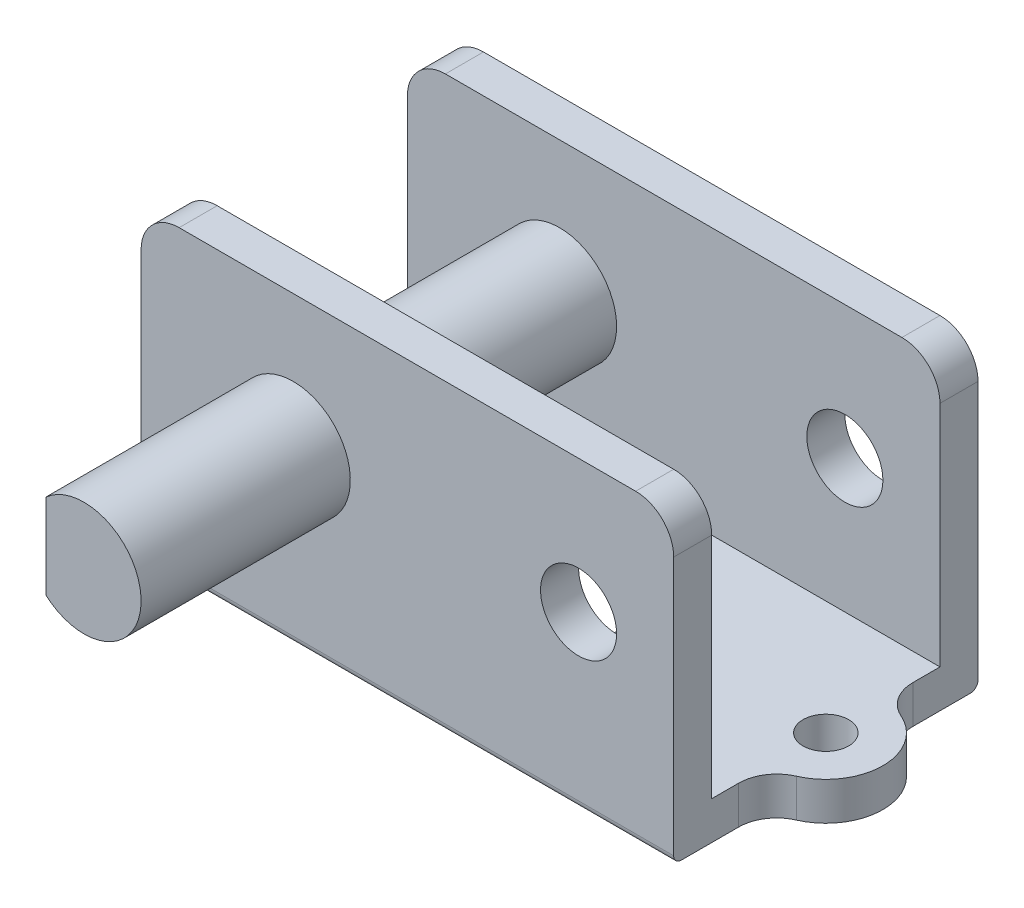
ISO-10303-21;
HEADER;
FILE_DESCRIPTION(('STEP AP214'),'2;1');
FILE_NAME('part.step','',(''),(''),'','','');
FILE_SCHEMA(('AUTOMOTIVE_DESIGN { 1 0 10303 214 1 1 1 1 }'));
ENDSEC;
DATA;
#1=APPLICATION_CONTEXT('core data for automotive mechanical design processes');
#2=APPLICATION_PROTOCOL_DEFINITION('international standard','automotive_design',2000,#1);
#3=PRODUCT_CONTEXT('',#1,'mechanical');
#4=PRODUCT('Part','Part','',(#3));
#5=PRODUCT_RELATED_PRODUCT_CATEGORY('part','',(#4));
#6=PRODUCT_DEFINITION_FORMATION('','',#4);
#7=PRODUCT_DEFINITION_CONTEXT('part definition',#1,'design');
#8=PRODUCT_DEFINITION('design','',#6,#7);
#9=PRODUCT_DEFINITION_SHAPE('','',#8);
#10=(LENGTH_UNIT() NAMED_UNIT(*) SI_UNIT(.MILLI.,.METRE.));
#11=(NAMED_UNIT(*) PLANE_ANGLE_UNIT() SI_UNIT($,.RADIAN.));
#12=(NAMED_UNIT(*) SI_UNIT($,.STERADIAN.) SOLID_ANGLE_UNIT());
#13=UNCERTAINTY_MEASURE_WITH_UNIT(LENGTH_MEASURE(1.E-05),#10,'distance_accuracy_value','');
#14=(GEOMETRIC_REPRESENTATION_CONTEXT(3) GLOBAL_UNCERTAINTY_ASSIGNED_CONTEXT((#13)) GLOBAL_UNIT_ASSIGNED_CONTEXT((#10,
#11,#12)) REPRESENTATION_CONTEXT('',''));
#15=CARTESIAN_POINT('',(0.,0.,0.));
#16=DIRECTION('',(0.,0.,1.));
#17=DIRECTION('',(1.,0.,0.));
#18=AXIS2_PLACEMENT_3D('',#15,#16,#17);
#19=CARTESIAN_POINT('',(-7.,0.,4.));
#20=DIRECTION('',(1.,0.,0.));
#21=DIRECTION('',(0.,0.,-1.));
#22=AXIS2_PLACEMENT_3D('',#19,#20,#21);
#23=PLANE('',#22);
#24=DIRECTION('',(0.,0.,1.));
#25=VECTOR('',#24,1.);
#26=CARTESIAN_POINT('',(-7.,1.,0.));
#27=LINE('',#26,#25);
#28=CARTESIAN_POINT('',(-7.,1.,2.29128784747792));
#29=VERTEX_POINT('',#28);
#30=CARTESIAN_POINT('',(-7.,1.,3.));
#31=VERTEX_POINT('',#30);
#32=EDGE_CURVE('E253',#29,#31,#27,.T.);
#33=ORIENTED_EDGE('',*,*,#32,.F.);
#34=DIRECTION('',(0.,-1.,0.));
#35=VECTOR('',#34,1.);
#36=CARTESIAN_POINT('',(-7.,0.,2.29128784747792));
#37=LINE('',#36,#35);
#38=CARTESIAN_POINT('',(-7.,0.,2.29128784747792));
#39=VERTEX_POINT('',#38);
#40=EDGE_CURVE('E386',#29,#39,#37,.T.);
#41=ORIENTED_EDGE('',*,*,#40,.T.);
#42=DIRECTION('',(0.,0.,-1.));
#43=VECTOR('',#42,1.);
#44=CARTESIAN_POINT('',(-7.,0.,4.));
#45=LINE('',#44,#43);
#46=CARTESIAN_POINT('',(-7.,0.,3.8));
#47=VERTEX_POINT('',#46);
#48=EDGE_CURVE('E296',#47,#39,#45,.T.);
#49=ORIENTED_EDGE('',*,*,#48,.F.);
#50=CARTESIAN_POINT('',(-7.,0.199999999999999,3.8));
#51=DIRECTION('',(1.,0.,0.));
#52=DIRECTION('',(0.,0.,-1.));
#53=AXIS2_PLACEMENT_3D('',#50,#51,#52);
#54=CIRCLE('',#53,0.2);
#55=CARTESIAN_POINT('',(-7.,0.199999999999999,4.));
#56=VERTEX_POINT('',#55);
#57=EDGE_CURVE('E319',#47,#56,#54,.F.);
#58=ORIENTED_EDGE('',*,*,#57,.T.);
#59=DIRECTION('',(0.,-1.,0.));
#60=VECTOR('',#59,1.);
#61=CARTESIAN_POINT('',(-7.,0.,4.));
#62=LINE('',#61,#60);
#63=CARTESIAN_POINT('',(-7.,7.,4.));
#64=VERTEX_POINT('',#63);
#65=EDGE_CURVE('E287',#64,#56,#62,.T.);
#66=ORIENTED_EDGE('',*,*,#65,.F.);
#67=DIRECTION('',(0.,0.,-1.));
#68=VECTOR('',#67,1.);
#69=CARTESIAN_POINT('',(-7.,7.,4.));
#70=LINE('',#69,#68);
#71=CARTESIAN_POINT('',(-7.,7.,3.));
#72=VERTEX_POINT('',#71);
#73=EDGE_CURVE('E358',#64,#72,#70,.T.);
#74=ORIENTED_EDGE('',*,*,#73,.T.);
#75=DIRECTION('',(0.,1.,0.));
#76=VECTOR('',#75,1.);
#77=CARTESIAN_POINT('',(-7.,0.,3.));
#78=LINE('',#77,#76);
#79=EDGE_CURVE('E250',#31,#72,#78,.T.);
#80=ORIENTED_EDGE('',*,*,#79,.F.);
#81=EDGE_LOOP('',(#33,#41,#49,#58,#66,#74,#80));
#82=FACE_BOUND('',#81,.T.);
#83=ADVANCED_FACE('F53',(#82),#23,.F.);
#84=CARTESIAN_POINT('',(7.,8.,4.));
#85=DIRECTION('',(-1.,0.,0.));
#86=DIRECTION('',(0.,-1.,0.));
#87=AXIS2_PLACEMENT_3D('',#84,#85,#86);
#88=PLANE('',#87);
#89=DIRECTION('',(0.,0.,1.));
#90=VECTOR('',#89,1.);
#91=CARTESIAN_POINT('',(7.,1.,0.));
#92=LINE('',#91,#90);
#93=CARTESIAN_POINT('',(7.,1.,-3.));
#94=VERTEX_POINT('',#93);
#95=CARTESIAN_POINT('',(7.,1.,-2.29128784747792));
#96=VERTEX_POINT('',#95);
#97=EDGE_CURVE('E244',#94,#96,#92,.T.);
#98=ORIENTED_EDGE('',*,*,#97,.T.);
#99=DIRECTION('',(0.,1.,0.));
#100=VECTOR('',#99,1.);
#101=CARTESIAN_POINT('',(7.,0.,-2.29128784747792));
#102=LINE('',#101,#100);
#103=CARTESIAN_POINT('',(7.,0.,-2.29128784747792));
#104=VERTEX_POINT('',#103);
#105=EDGE_CURVE('E375',#96,#104,#102,.F.);
#106=ORIENTED_EDGE('',*,*,#105,.T.);
#107=DIRECTION('',(0.,0.,-1.));
#108=VECTOR('',#107,1.);
#109=CARTESIAN_POINT('',(7.,0.,4.));
#110=LINE('',#109,#108);
#111=CARTESIAN_POINT('',(7.,0.,-3.8));
#112=VERTEX_POINT('',#111);
#113=EDGE_CURVE('E299',#104,#112,#110,.T.);
#114=ORIENTED_EDGE('',*,*,#113,.T.);
#115=CARTESIAN_POINT('',(7.,0.200000000000001,-3.8));
#116=DIRECTION('',(-1.,0.,0.));
#117=DIRECTION('',(0.,-1.,0.));
#118=AXIS2_PLACEMENT_3D('',#115,#116,#117);
#119=CIRCLE('',#118,0.2);
#120=CARTESIAN_POINT('',(7.,0.200000000000001,-4.));
#121=VERTEX_POINT('',#120);
#122=EDGE_CURVE('E314',#112,#121,#119,.F.);
#123=ORIENTED_EDGE('',*,*,#122,.T.);
#124=DIRECTION('',(0.,1.,0.));
#125=VECTOR('',#124,1.);
#126=CARTESIAN_POINT('',(7.,8.,-4.));
#127=LINE('',#126,#125);
#128=CARTESIAN_POINT('',(7.,7.,-4.));
#129=VERTEX_POINT('',#128);
#130=EDGE_CURVE('E279',#121,#129,#127,.T.);
#131=ORIENTED_EDGE('',*,*,#130,.T.);
#132=DIRECTION('',(0.,0.,-1.));
#133=VECTOR('',#132,1.);
#134=CARTESIAN_POINT('',(7.,7.,4.));
#135=LINE('',#134,#133);
#136=CARTESIAN_POINT('',(7.,7.,-3.));
#137=VERTEX_POINT('',#136);
#138=EDGE_CURVE('E339',#129,#137,#135,.F.);
#139=ORIENTED_EDGE('',*,*,#138,.T.);
#140=DIRECTION('',(0.,1.,0.));
#141=VECTOR('',#140,1.);
#142=CARTESIAN_POINT('',(7.,0.,-3.));
#143=LINE('',#142,#141);
#144=EDGE_CURVE('E247',#94,#137,#143,.T.);
#145=ORIENTED_EDGE('',*,*,#144,.F.);
#146=EDGE_LOOP('',(#98,#106,#114,#123,#131,#139,#145));
#147=FACE_BOUND('',#146,.T.);
#148=ADVANCED_FACE('F423',(#147),#88,.F.);
#149=CARTESIAN_POINT('',(7.,0.,3.8));
#150=VERTEX_POINT('',#149);
#151=CARTESIAN_POINT('',(7.,0.,2.29128784747792));
#152=VERTEX_POINT('',#151);
#153=EDGE_CURVE('E300',#150,#152,#110,.T.);
#154=ORIENTED_EDGE('',*,*,#153,.T.);
#155=DIRECTION('',(0.,1.,0.));
#156=VECTOR('',#155,1.);
#157=CARTESIAN_POINT('',(7.,1.,2.29128784747792));
#158=LINE('',#157,#156);
#159=CARTESIAN_POINT('',(7.,1.,2.29128784747792));
#160=VERTEX_POINT('',#159);
#161=EDGE_CURVE('E377',#152,#160,#158,.T.);
#162=ORIENTED_EDGE('',*,*,#161,.T.);
#163=CARTESIAN_POINT('',(7.,1.,3.));
#164=VERTEX_POINT('',#163);
#165=EDGE_CURVE('E243',#160,#164,#92,.T.);
#166=ORIENTED_EDGE('',*,*,#165,.T.);
#167=DIRECTION('',(0.,1.,0.));
#168=VECTOR('',#167,1.);
#169=CARTESIAN_POINT('',(7.,0.,3.));
#170=LINE('',#169,#168);
#171=CARTESIAN_POINT('',(7.,7.,3.));
#172=VERTEX_POINT('',#171);
#173=EDGE_CURVE('E240',#164,#172,#170,.T.);
#174=ORIENTED_EDGE('',*,*,#173,.T.);
#175=DIRECTION('',(0.,0.,-1.));
#176=VECTOR('',#175,1.);
#177=CARTESIAN_POINT('',(7.,7.,4.));
#178=LINE('',#177,#176);
#179=CARTESIAN_POINT('',(7.,7.,4.));
#180=VERTEX_POINT('',#179);
#181=EDGE_CURVE('E337',#172,#180,#178,.F.);
#182=ORIENTED_EDGE('',*,*,#181,.T.);
#183=DIRECTION('',(0.,1.,0.));
#184=VECTOR('',#183,1.);
#185=CARTESIAN_POINT('',(7.,8.,4.));
#186=LINE('',#185,#184);
#187=CARTESIAN_POINT('',(7.,0.200000000000001,4.));
#188=VERTEX_POINT('',#187);
#189=EDGE_CURVE('E280',#188,#180,#186,.T.);
#190=ORIENTED_EDGE('',*,*,#189,.F.);
#191=CARTESIAN_POINT('',(7.,0.200000000000001,3.8));
#192=DIRECTION('',(-1.,0.,0.));
#193=DIRECTION('',(0.,-1.,0.));
#194=AXIS2_PLACEMENT_3D('',#191,#192,#193);
#195=CIRCLE('',#194,0.2);
#196=EDGE_CURVE('E312',#188,#150,#195,.F.);
#197=ORIENTED_EDGE('',*,*,#196,.T.);
#198=EDGE_LOOP('',(#154,#162,#166,#174,#182,#190,#197));
#199=FACE_BOUND('',#198,.T.);
#200=ADVANCED_FACE('F429',(#199),#88,.F.);
#201=CARTESIAN_POINT('',(-7.,8.,4.));
#202=DIRECTION('',(0.,-1.,0.));
#203=DIRECTION('',(0.,0.,-1.));
#204=AXIS2_PLACEMENT_3D('',#201,#202,#203);
#205=PLANE('',#204);
#206=DIRECTION('',(-1.,0.,0.));
#207=VECTOR('',#206,1.);
#208=CARTESIAN_POINT('',(-7.,8.,4.));
#209=LINE('',#208,#207);
#210=CARTESIAN_POINT('',(5.99999999999999,8.,4.));
#211=VERTEX_POINT('',#210);
#212=CARTESIAN_POINT('',(-6.,8.,4.));
#213=VERTEX_POINT('',#212);
#214=EDGE_CURVE('E283',#211,#213,#209,.T.);
#215=ORIENTED_EDGE('',*,*,#214,.F.);
#216=DIRECTION('',(0.,0.,-1.));
#217=VECTOR('',#216,1.);
#218=CARTESIAN_POINT('',(6.,8.,4.));
#219=LINE('',#218,#217);
#220=CARTESIAN_POINT('',(6.,8.,3.));
#221=VERTEX_POINT('',#220);
#222=EDGE_CURVE('E347',#211,#221,#219,.T.);
#223=ORIENTED_EDGE('',*,*,#222,.T.);
#224=DIRECTION('',(1.,0.,0.));
#225=VECTOR('',#224,1.);
#226=CARTESIAN_POINT('',(-7.,8.,3.));
#227=LINE('',#226,#225);
#228=CARTESIAN_POINT('',(-6.,8.,3.));
#229=VERTEX_POINT('',#228);
#230=EDGE_CURVE('E266',#229,#221,#227,.T.);
#231=ORIENTED_EDGE('',*,*,#230,.F.);
#232=DIRECTION('',(0.,0.,-1.));
#233=VECTOR('',#232,1.);
#234=CARTESIAN_POINT('',(-6.,8.,4.));
#235=LINE('',#234,#233);
#236=EDGE_CURVE('E345',#229,#213,#235,.F.);
#237=ORIENTED_EDGE('',*,*,#236,.T.);
#238=EDGE_LOOP('',(#215,#223,#231,#237));
#239=FACE_BOUND('',#238,.T.);
#240=ADVANCED_FACE('F446',(#239),#205,.F.);
#241=CARTESIAN_POINT('',(4.5,4.5,-4.));
#242=DIRECTION('',(0.,0.,1.));
#243=DIRECTION('',(1.,0.,0.));
#244=AXIS2_PLACEMENT_3D('',#241,#242,#243);
#245=CYLINDRICAL_SURFACE('',#244,1.);
#246=CARTESIAN_POINT('',(4.5,4.5,4.));
#247=DIRECTION('',(0.,0.,1.));
#248=DIRECTION('',(1.,0.,0.));
#249=AXIS2_PLACEMENT_3D('',#246,#247,#248);
#250=CIRCLE('',#249,1.);
#251=CARTESIAN_POINT('',(5.5,4.5,4.));
#252=VERTEX_POINT('',#251);
#253=EDGE_CURVE('E273',#252,#252,#250,.T.);
#254=ORIENTED_EDGE('',*,*,#253,.T.);
#255=EDGE_LOOP('',(#254));
#256=FACE_BOUND('',#255,.T.);
#257=CARTESIAN_POINT('',(4.5,4.5,3.));
#258=DIRECTION('',(0.,0.,-1.));
#259=DIRECTION('',(-1.,0.,0.));
#260=AXIS2_PLACEMENT_3D('',#257,#258,#259);
#261=CIRCLE('',#260,1.);
#262=CARTESIAN_POINT('',(3.5,4.5,3.));
#263=VERTEX_POINT('',#262);
#264=EDGE_CURVE('E263',#263,#263,#261,.F.);
#265=ORIENTED_EDGE('',*,*,#264,.F.);
#266=EDGE_LOOP('',(#265));
#267=FACE_BOUND('',#266,.T.);
#268=ADVANCED_FACE('F444',(#256,#267),#245,.F.);
#269=DIRECTION('',(1.,0.,0.));
#270=VECTOR('',#269,1.);
#271=CARTESIAN_POINT('',(-7.,8.,-3.));
#272=LINE('',#271,#270);
#273=CARTESIAN_POINT('',(-6.,8.,-3.));
#274=VERTEX_POINT('',#273);
#275=CARTESIAN_POINT('',(6.,8.,-3.));
#276=VERTEX_POINT('',#275);
#277=EDGE_CURVE('E270',#274,#276,#272,.T.);
#278=ORIENTED_EDGE('',*,*,#277,.T.);
#279=DIRECTION('',(0.,0.,-1.));
#280=VECTOR('',#279,1.);
#281=CARTESIAN_POINT('',(6.,8.,4.));
#282=LINE('',#281,#280);
#283=CARTESIAN_POINT('',(5.99999999999999,8.,-4.));
#284=VERTEX_POINT('',#283);
#285=EDGE_CURVE('E330',#276,#284,#282,.T.);
#286=ORIENTED_EDGE('',*,*,#285,.T.);
#287=DIRECTION('',(-1.,0.,0.));
#288=VECTOR('',#287,1.);
#289=CARTESIAN_POINT('',(-7.,8.,-4.));
#290=LINE('',#289,#288);
#291=CARTESIAN_POINT('',(-6.,8.,-4.));
#292=VERTEX_POINT('',#291);
#293=EDGE_CURVE('E292',#284,#292,#290,.T.);
#294=ORIENTED_EDGE('',*,*,#293,.T.);
#295=DIRECTION('',(0.,0.,-1.));
#296=VECTOR('',#295,1.);
#297=CARTESIAN_POINT('',(-6.,8.,4.));
#298=LINE('',#297,#296);
#299=EDGE_CURVE('E328',#292,#274,#298,.F.);
#300=ORIENTED_EDGE('',*,*,#299,.T.);
#301=EDGE_LOOP('',(#278,#286,#294,#300));
#302=FACE_BOUND('',#301,.T.);
#303=ADVANCED_FACE('F436',(#302),#205,.F.);
#304=CARTESIAN_POINT('',(-7.,0.,-2.29128784747792));
#305=VERTEX_POINT('',#304);
#306=CARTESIAN_POINT('',(-7.,0.,-3.8));
#307=VERTEX_POINT('',#306);
#308=EDGE_CURVE('E289',#305,#307,#45,.T.);
#309=ORIENTED_EDGE('',*,*,#308,.F.);
#310=DIRECTION('',(0.,-1.,0.));
#311=VECTOR('',#310,1.);
#312=CARTESIAN_POINT('',(-7.,0.,-2.29128784747792));
#313=LINE('',#312,#311);
#314=CARTESIAN_POINT('',(-7.,1.,-2.29128784747792));
#315=VERTEX_POINT('',#314);
#316=EDGE_CURVE('E379',#305,#315,#313,.F.);
#317=ORIENTED_EDGE('',*,*,#316,.T.);
#318=CARTESIAN_POINT('',(-7.,1.,-3.));
#319=VERTEX_POINT('',#318);
#320=EDGE_CURVE('E254',#319,#315,#27,.T.);
#321=ORIENTED_EDGE('',*,*,#320,.F.);
#322=DIRECTION('',(0.,1.,0.));
#323=VECTOR('',#322,1.);
#324=CARTESIAN_POINT('',(-7.,0.,-3.));
#325=LINE('',#324,#323);
#326=CARTESIAN_POINT('',(-7.,7.,-3.));
#327=VERTEX_POINT('',#326);
#328=EDGE_CURVE('E257',#319,#327,#325,.T.);
#329=ORIENTED_EDGE('',*,*,#328,.T.);
#330=DIRECTION('',(0.,0.,-1.));
#331=VECTOR('',#330,1.);
#332=CARTESIAN_POINT('',(-7.,7.,4.));
#333=LINE('',#332,#331);
#334=CARTESIAN_POINT('',(-7.,7.,-4.));
#335=VERTEX_POINT('',#334);
#336=EDGE_CURVE('E361',#327,#335,#333,.T.);
#337=ORIENTED_EDGE('',*,*,#336,.T.);
#338=DIRECTION('',(0.,-1.,0.));
#339=VECTOR('',#338,1.);
#340=CARTESIAN_POINT('',(-7.,0.,-4.));
#341=LINE('',#340,#339);
#342=CARTESIAN_POINT('',(-7.,0.199999999999999,-4.));
#343=VERTEX_POINT('',#342);
#344=EDGE_CURVE('E284',#335,#343,#341,.T.);
#345=ORIENTED_EDGE('',*,*,#344,.T.);
#346=CARTESIAN_POINT('',(-7.,0.199999999999999,-3.8));
#347=DIRECTION('',(1.,0.,0.));
#348=DIRECTION('',(0.,0.,-1.));
#349=AXIS2_PLACEMENT_3D('',#346,#347,#348);
#350=CIRCLE('',#349,0.2);
#351=EDGE_CURVE('E322',#343,#307,#350,.F.);
#352=ORIENTED_EDGE('',*,*,#351,.T.);
#353=EDGE_LOOP('',(#309,#317,#321,#329,#337,#345,#352));
#354=FACE_BOUND('',#353,.T.);
#355=ADVANCED_FACE('F425',(#354),#23,.F.);
#356=CARTESIAN_POINT('',(0.,0.,4.));
#357=DIRECTION('',(0.,1.,0.));
#358=DIRECTION('',(-1.,0.,0.));
#359=AXIS2_PLACEMENT_3D('',#356,#357,#358);
#360=PLANE('',#359);
#361=CARTESIAN_POINT('',(0.,0.,0.));
#362=DIRECTION('',(0.,-1.,0.));
#363=DIRECTION('',(1.,0.,0.));
#364=AXIS2_PLACEMENT_3D('',#361,#362,#363);
#365=CIRCLE('',#364,2.);
#366=CARTESIAN_POINT('',(2.,0.,0.));
#367=VERTEX_POINT('',#366);
#368=EDGE_CURVE('E222',#367,#367,#365,.T.);
#369=ORIENTED_EDGE('',*,*,#368,.F.);
#370=EDGE_LOOP('',(#369));
#371=FACE_BOUND('',#370,.T.);
#372=CARTESIAN_POINT('',(-7.,0.,0.));
#373=DIRECTION('',(0.,-1.,0.));
#374=DIRECTION('',(1.,0.,0.));
#375=AXIS2_PLACEMENT_3D('',#372,#373,#374);
#376=CIRCLE('',#375,0.6);
#377=CARTESIAN_POINT('',(-6.4,0.,0.));
#378=VERTEX_POINT('',#377);
#379=EDGE_CURVE('E865',#378,#378,#376,.T.);
#380=ORIENTED_EDGE('',*,*,#379,.F.);
#381=EDGE_LOOP('',(#380));
#382=FACE_BOUND('',#381,.T.);
#383=CARTESIAN_POINT('',(7.,0.,0.));
#384=DIRECTION('',(0.,-1.,0.));
#385=DIRECTION('',(1.,0.,0.));
#386=AXIS2_PLACEMENT_3D('',#383,#384,#385);
#387=CIRCLE('',#386,0.6);
#388=CARTESIAN_POINT('',(7.6,0.,0.));
#389=VERTEX_POINT('',#388);
#390=EDGE_CURVE('E466',#389,#389,#387,.T.);
#391=ORIENTED_EDGE('',*,*,#390,.F.);
#392=EDGE_LOOP('',(#391));
#393=FACE_BOUND('',#392,.T.);
#394=ORIENTED_EDGE('',*,*,#48,.T.);
#395=CARTESIAN_POINT('',(-8.,0.,2.29128784747792));
#396=DIRECTION('',(0.,1.,0.));
#397=DIRECTION('',(-1.,0.,0.));
#398=AXIS2_PLACEMENT_3D('',#395,#396,#397);
#399=CIRCLE('',#398,1.);
#400=CARTESIAN_POINT('',(-7.6,0.,1.37477270848675));
#401=VERTEX_POINT('',#400);
#402=EDGE_CURVE('E74',#39,#401,#399,.T.);
#403=ORIENTED_EDGE('',*,*,#402,.T.);
#404=CARTESIAN_POINT('',(-7.,0.,0.));
#405=DIRECTION('',(0.,-1.,0.));
#406=DIRECTION('',(1.,0.,0.));
#407=AXIS2_PLACEMENT_3D('',#404,#405,#406);
#408=CIRCLE('',#407,1.5);
#409=CARTESIAN_POINT('',(-7.6,0.,-1.37477270848675));
#410=VERTEX_POINT('',#409);
#411=EDGE_CURVE('E460',#401,#410,#408,.T.);
#412=ORIENTED_EDGE('',*,*,#411,.T.);
#413=CARTESIAN_POINT('',(-8.,0.,-2.29128784747792));
#414=DIRECTION('',(0.,1.,0.));
#415=DIRECTION('',(-1.,0.,0.));
#416=AXIS2_PLACEMENT_3D('',#413,#414,#415);
#417=CIRCLE('',#416,1.);
#418=EDGE_CURVE('E398',#410,#305,#417,.T.);
#419=ORIENTED_EDGE('',*,*,#418,.T.);
#420=ORIENTED_EDGE('',*,*,#308,.T.);
#421=DIRECTION('',(1.,0.,0.));
#422=VECTOR('',#421,1.);
#423=CARTESIAN_POINT('',(7.,0.,-3.8));
#424=LINE('',#423,#422);
#425=EDGE_CURVE('E309',#307,#112,#424,.T.);
#426=ORIENTED_EDGE('',*,*,#425,.T.);
#427=ORIENTED_EDGE('',*,*,#113,.F.);
#428=CARTESIAN_POINT('',(8.,0.,-2.29128784747792));
#429=DIRECTION('',(0.,1.,0.));
#430=DIRECTION('',(-1.,0.,0.));
#431=AXIS2_PLACEMENT_3D('',#428,#429,#430);
#432=CIRCLE('',#431,1.);
#433=CARTESIAN_POINT('',(7.6,0.,-1.37477270848675));
#434=VERTEX_POINT('',#433);
#435=EDGE_CURVE('E390',#104,#434,#432,.T.);
#436=ORIENTED_EDGE('',*,*,#435,.T.);
#437=CARTESIAN_POINT('',(7.,0.,0.));
#438=DIRECTION('',(0.,-1.,0.));
#439=DIRECTION('',(1.,0.,0.));
#440=AXIS2_PLACEMENT_3D('',#437,#438,#439);
#441=CIRCLE('',#440,1.5);
#442=CARTESIAN_POINT('',(7.6,0.,1.37477270848675));
#443=VERTEX_POINT('',#442);
#444=EDGE_CURVE('E459',#443,#434,#441,.F.);
#445=ORIENTED_EDGE('',*,*,#444,.F.);
#446=CARTESIAN_POINT('',(8.,0.,2.29128784747792));
#447=DIRECTION('',(0.,1.,0.));
#448=DIRECTION('',(-1.,0.,0.));
#449=AXIS2_PLACEMENT_3D('',#446,#447,#448);
#450=CIRCLE('',#449,1.);
#451=EDGE_CURVE('E392',#443,#152,#450,.T.);
#452=ORIENTED_EDGE('',*,*,#451,.T.);
#453=ORIENTED_EDGE('',*,*,#153,.F.);
#454=DIRECTION('',(1.,0.,0.));
#455=VECTOR('',#454,1.);
#456=CARTESIAN_POINT('',(0.,0.,3.8));
#457=LINE('',#456,#455);
#458=EDGE_CURVE('E303',#150,#47,#457,.F.);
#459=ORIENTED_EDGE('',*,*,#458,.T.);
#460=EDGE_LOOP('',(#394,#403,#412,#419,#420,#426,#427,#436,#445,#452,#453,#459));
#461=FACE_BOUND('',#460,.T.);
#462=ADVANCED_FACE('F435',(#371,#382,#393,#461),#360,.F.);
#463=CARTESIAN_POINT('',(0.,0.,4.));
#464=DIRECTION('',(0.,0.,-1.));
#465=DIRECTION('',(-1.,0.,0.));
#466=AXIS2_PLACEMENT_3D('',#463,#464,#465);
#467=PLANE('',#466);
#468=CARTESIAN_POINT('',(-3.,4.5,4.));
#469=DIRECTION('',(0.,0.,-1.));
#470=DIRECTION('',(-1.,0.,0.));
#471=AXIS2_PLACEMENT_3D('',#468,#469,#470);
#472=CIRCLE('',#471,1.5);
#473=CARTESIAN_POINT('',(-4.5,4.5,4.));
#474=VERTEX_POINT('',#473);
#475=EDGE_CURVE('E237',#474,#474,#472,.T.);
#476=ORIENTED_EDGE('',*,*,#475,.T.);
#477=EDGE_LOOP('',(#476));
#478=FACE_BOUND('',#477,.T.);
#479=ORIENTED_EDGE('',*,*,#253,.F.);
#480=EDGE_LOOP('',(#479));
#481=FACE_BOUND('',#480,.T.);
#482=ORIENTED_EDGE('',*,*,#189,.T.);
#483=CARTESIAN_POINT('',(6.,7.,4.));
#484=DIRECTION('',(0.,0.,-1.));
#485=DIRECTION('',(-1.,0.,0.));
#486=AXIS2_PLACEMENT_3D('',#483,#484,#485);
#487=CIRCLE('',#486,1.);
#488=EDGE_CURVE('E356',#180,#211,#487,.F.);
#489=ORIENTED_EDGE('',*,*,#488,.T.);
#490=ORIENTED_EDGE('',*,*,#214,.T.);
#491=CARTESIAN_POINT('',(-6.,7.,4.));
#492=DIRECTION('',(0.,0.,-1.));
#493=DIRECTION('',(-1.,0.,0.));
#494=AXIS2_PLACEMENT_3D('',#491,#492,#493);
#495=CIRCLE('',#494,1.);
#496=EDGE_CURVE('E354',#213,#64,#495,.F.);
#497=ORIENTED_EDGE('',*,*,#496,.T.);
#498=ORIENTED_EDGE('',*,*,#65,.T.);
#499=DIRECTION('',(1.,0.,0.));
#500=VECTOR('',#499,1.);
#501=CARTESIAN_POINT('',(0.,0.2,4.));
#502=LINE('',#501,#500);
#503=EDGE_CURVE('E325',#56,#188,#502,.T.);
#504=ORIENTED_EDGE('',*,*,#503,.T.);
#505=EDGE_LOOP('',(#482,#489,#490,#497,#498,#504));
#506=FACE_BOUND('',#505,.T.);
#507=ADVANCED_FACE('F442',(#478,#481,#506),#467,.F.);
#508=CARTESIAN_POINT('',(0.,0.,-4.));
#509=DIRECTION('',(0.,0.,-1.));
#510=DIRECTION('',(-1.,0.,0.));
#511=AXIS2_PLACEMENT_3D('',#508,#509,#510);
#512=PLANE('',#511);
#513=CARTESIAN_POINT('',(4.5,4.5,-4.));
#514=DIRECTION('',(0.,0.,1.));
#515=DIRECTION('',(1.,0.,0.));
#516=AXIS2_PLACEMENT_3D('',#513,#514,#515);
#517=CIRCLE('',#516,1.);
#518=CARTESIAN_POINT('',(5.5,4.5,-4.));
#519=VERTEX_POINT('',#518);
#520=EDGE_CURVE('E276',#519,#519,#517,.T.);
#521=ORIENTED_EDGE('',*,*,#520,.T.);
#522=EDGE_LOOP('',(#521));
#523=FACE_BOUND('',#522,.T.);
#524=ORIENTED_EDGE('',*,*,#293,.F.);
#525=CARTESIAN_POINT('',(6.,7.,-4.));
#526=DIRECTION('',(0.,0.,-1.));
#527=DIRECTION('',(-1.,0.,0.));
#528=AXIS2_PLACEMENT_3D('',#525,#526,#527);
#529=CIRCLE('',#528,1.);
#530=EDGE_CURVE('E335',#284,#129,#529,.T.);
#531=ORIENTED_EDGE('',*,*,#530,.T.);
#532=ORIENTED_EDGE('',*,*,#130,.F.);
#533=DIRECTION('',(1.,0.,0.));
#534=VECTOR('',#533,1.);
#535=CARTESIAN_POINT('',(-7.,0.199999999999999,-4.));
#536=LINE('',#535,#534);
#537=EDGE_CURVE('E316',#121,#343,#536,.F.);
#538=ORIENTED_EDGE('',*,*,#537,.T.);
#539=ORIENTED_EDGE('',*,*,#344,.F.);
#540=CARTESIAN_POINT('',(-6.,7.,-4.));
#541=DIRECTION('',(0.,0.,-1.));
#542=DIRECTION('',(-1.,0.,0.));
#543=AXIS2_PLACEMENT_3D('',#540,#541,#542);
#544=CIRCLE('',#543,1.);
#545=EDGE_CURVE('E333',#335,#292,#544,.T.);
#546=ORIENTED_EDGE('',*,*,#545,.T.);
#547=EDGE_LOOP('',(#524,#531,#532,#538,#539,#546));
#548=FACE_BOUND('',#547,.T.);
#549=ADVANCED_FACE('F632',(#523,#548),#512,.T.);
#550=CARTESIAN_POINT('',(4.5,4.5,-3.));
#551=DIRECTION('',(0.,0.,-1.));
#552=DIRECTION('',(-1.,0.,0.));
#553=AXIS2_PLACEMENT_3D('',#550,#551,#552);
#554=CIRCLE('',#553,1.);
#555=CARTESIAN_POINT('',(3.5,4.5,-3.));
#556=VERTEX_POINT('',#555);
#557=EDGE_CURVE('E269',#556,#556,#554,.F.);
#558=ORIENTED_EDGE('',*,*,#557,.T.);
#559=EDGE_LOOP('',(#558));
#560=FACE_BOUND('',#559,.T.);
#561=ORIENTED_EDGE('',*,*,#520,.F.);
#562=EDGE_LOOP('',(#561));
#563=FACE_BOUND('',#562,.T.);
#564=ADVANCED_FACE('F625',(#560,#563),#245,.F.);
#565=CARTESIAN_POINT('',(-7.,0.,-3.));
#566=DIRECTION('',(0.,0.,-1.));
#567=DIRECTION('',(-1.,0.,0.));
#568=AXIS2_PLACEMENT_3D('',#565,#566,#567);
#569=PLANE('',#568);
#570=CARTESIAN_POINT('',(-3.,4.5,-3.));
#571=DIRECTION('',(0.,0.,1.));
#572=DIRECTION('',(1.,0.,0.));
#573=AXIS2_PLACEMENT_3D('',#570,#571,#572);
#574=CIRCLE('',#573,1.5);
#575=CARTESIAN_POINT('',(-1.5,4.5,-3.));
#576=VERTEX_POINT('',#575);
#577=EDGE_CURVE('E229',#576,#576,#574,.T.);
#578=ORIENTED_EDGE('',*,*,#577,.F.);
#579=EDGE_LOOP('',(#578));
#580=FACE_BOUND('',#579,.T.);
#581=ORIENTED_EDGE('',*,*,#557,.F.);
#582=EDGE_LOOP('',(#581));
#583=FACE_BOUND('',#582,.T.);
#584=ORIENTED_EDGE('',*,*,#144,.T.);
#585=CARTESIAN_POINT('',(6.,7.,-3.));
#586=DIRECTION('',(0.,0.,-1.));
#587=DIRECTION('',(-1.,0.,0.));
#588=AXIS2_PLACEMENT_3D('',#585,#586,#587);
#589=CIRCLE('',#588,1.);
#590=EDGE_CURVE('E343',#137,#276,#589,.F.);
#591=ORIENTED_EDGE('',*,*,#590,.T.);
#592=ORIENTED_EDGE('',*,*,#277,.F.);
#593=CARTESIAN_POINT('',(-6.,7.,-3.));
#594=DIRECTION('',(0.,0.,-1.));
#595=DIRECTION('',(-1.,0.,0.));
#596=AXIS2_PLACEMENT_3D('',#593,#594,#595);
#597=CIRCLE('',#596,1.);
#598=EDGE_CURVE('E341',#274,#327,#597,.F.);
#599=ORIENTED_EDGE('',*,*,#598,.T.);
#600=ORIENTED_EDGE('',*,*,#328,.F.);
#601=DIRECTION('',(1.,0.,0.));
#602=VECTOR('',#601,1.);
#603=CARTESIAN_POINT('',(-7.,1.,-3.));
#604=LINE('',#603,#602);
#605=EDGE_CURVE('E261',#319,#94,#604,.T.);
#606=ORIENTED_EDGE('',*,*,#605,.T.);
#607=EDGE_LOOP('',(#584,#591,#592,#599,#600,#606));
#608=FACE_BOUND('',#607,.T.);
#609=ADVANCED_FACE('F623',(#580,#583,#608),#569,.F.);
#610=CARTESIAN_POINT('',(-7.,0.,3.));
#611=DIRECTION('',(0.,0.,-1.));
#612=DIRECTION('',(-1.,0.,0.));
#613=AXIS2_PLACEMENT_3D('',#610,#611,#612);
#614=PLANE('',#613);
#615=CARTESIAN_POINT('',(-3.,4.5,3.));
#616=DIRECTION('',(0.,0.,-1.));
#617=DIRECTION('',(-1.,0.,0.));
#618=AXIS2_PLACEMENT_3D('',#615,#616,#617);
#619=CIRCLE('',#618,1.5);
#620=CARTESIAN_POINT('',(-4.5,4.5,3.));
#621=VERTEX_POINT('',#620);
#622=EDGE_CURVE('E364',#621,#621,#619,.T.);
#623=ORIENTED_EDGE('',*,*,#622,.F.);
#624=EDGE_LOOP('',(#623));
#625=FACE_BOUND('',#624,.T.);
#626=ORIENTED_EDGE('',*,*,#264,.T.);
#627=EDGE_LOOP('',(#626));
#628=FACE_BOUND('',#627,.T.);
#629=ORIENTED_EDGE('',*,*,#230,.T.);
#630=CARTESIAN_POINT('',(6.,7.,3.));
#631=DIRECTION('',(0.,0.,-1.));
#632=DIRECTION('',(-1.,0.,0.));
#633=AXIS2_PLACEMENT_3D('',#630,#631,#632);
#634=CIRCLE('',#633,1.);
#635=EDGE_CURVE('E352',#221,#172,#634,.T.);
#636=ORIENTED_EDGE('',*,*,#635,.T.);
#637=ORIENTED_EDGE('',*,*,#173,.F.);
#638=DIRECTION('',(1.,0.,0.));
#639=VECTOR('',#638,1.);
#640=CARTESIAN_POINT('',(-7.,1.,3.));
#641=LINE('',#640,#639);
#642=EDGE_CURVE('E260',#31,#164,#641,.T.);
#643=ORIENTED_EDGE('',*,*,#642,.F.);
#644=ORIENTED_EDGE('',*,*,#79,.T.);
#645=CARTESIAN_POINT('',(-6.,7.,3.));
#646=DIRECTION('',(0.,0.,-1.));
#647=DIRECTION('',(-1.,0.,0.));
#648=AXIS2_PLACEMENT_3D('',#645,#646,#647);
#649=CIRCLE('',#648,1.);
#650=EDGE_CURVE('E350',#72,#229,#649,.T.);
#651=ORIENTED_EDGE('',*,*,#650,.T.);
#652=EDGE_LOOP('',(#629,#636,#637,#643,#644,#651));
#653=FACE_BOUND('',#652,.T.);
#654=ADVANCED_FACE('F499',(#625,#628,#653),#614,.T.);
#655=CARTESIAN_POINT('',(-7.,1.,0.));
#656=DIRECTION('',(0.,1.,0.));
#657=DIRECTION('',(0.,0.,1.));
#658=AXIS2_PLACEMENT_3D('',#655,#656,#657);
#659=PLANE('',#658);
#660=CARTESIAN_POINT('',(0.,1.,0.));
#661=DIRECTION('',(0.,-1.,0.));
#662=DIRECTION('',(1.,0.,0.));
#663=AXIS2_PLACEMENT_3D('',#660,#661,#662);
#664=CIRCLE('',#663,2.);
#665=CARTESIAN_POINT('',(2.,1.,0.));
#666=VERTEX_POINT('',#665);
#667=EDGE_CURVE('E864',#666,#666,#664,.T.);
#668=ORIENTED_EDGE('',*,*,#667,.T.);
#669=EDGE_LOOP('',(#668));
#670=FACE_BOUND('',#669,.T.);
#671=CARTESIAN_POINT('',(-7.,0.999999999999999,0.));
#672=DIRECTION('',(0.,-1.,0.));
#673=DIRECTION('',(1.,0.,0.));
#674=AXIS2_PLACEMENT_3D('',#671,#672,#673);
#675=CIRCLE('',#674,0.6);
#676=CARTESIAN_POINT('',(-6.4,0.999999999999999,0.));
#677=VERTEX_POINT('',#676);
#678=EDGE_CURVE('E463',#677,#677,#675,.T.);
#679=ORIENTED_EDGE('',*,*,#678,.T.);
#680=EDGE_LOOP('',(#679));
#681=FACE_BOUND('',#680,.T.);
#682=CARTESIAN_POINT('',(7.,1.,0.));
#683=DIRECTION('',(0.,-1.,0.));
#684=DIRECTION('',(1.,0.,0.));
#685=AXIS2_PLACEMENT_3D('',#682,#683,#684);
#686=CIRCLE('',#685,0.6);
#687=CARTESIAN_POINT('',(7.6,1.,0.));
#688=VERTEX_POINT('',#687);
#689=EDGE_CURVE('E860',#688,#688,#686,.T.);
#690=ORIENTED_EDGE('',*,*,#689,.T.);
#691=EDGE_LOOP('',(#690));
#692=FACE_BOUND('',#691,.T.);
#693=ORIENTED_EDGE('',*,*,#320,.T.);
#694=CARTESIAN_POINT('',(-8.,1.,-2.29128784747792));
#695=DIRECTION('',(0.,1.,0.));
#696=DIRECTION('',(0.,0.,1.));
#697=AXIS2_PLACEMENT_3D('',#694,#695,#696);
#698=CIRCLE('',#697,1.);
#699=CARTESIAN_POINT('',(-7.6,0.999999999999999,-1.37477270848675));
#700=VERTEX_POINT('',#699);
#701=EDGE_CURVE('E396',#315,#700,#698,.F.);
#702=ORIENTED_EDGE('',*,*,#701,.T.);
#703=CARTESIAN_POINT('',(-7.,0.999999999999999,0.));
#704=DIRECTION('',(0.,-1.,0.));
#705=DIRECTION('',(1.,0.,0.));
#706=AXIS2_PLACEMENT_3D('',#703,#704,#705);
#707=CIRCLE('',#706,1.5);
#708=CARTESIAN_POINT('',(-7.6,0.999999999999999,1.37477270848675));
#709=VERTEX_POINT('',#708);
#710=EDGE_CURVE('E407',#709,#700,#707,.T.);
#711=ORIENTED_EDGE('',*,*,#710,.F.);
#712=CARTESIAN_POINT('',(-8.,1.,2.29128784747792));
#713=DIRECTION('',(0.,1.,0.));
#714=DIRECTION('',(0.,0.,1.));
#715=AXIS2_PLACEMENT_3D('',#712,#713,#714);
#716=CIRCLE('',#715,1.);
#717=EDGE_CURVE('E61',#709,#29,#716,.F.);
#718=ORIENTED_EDGE('',*,*,#717,.T.);
#719=ORIENTED_EDGE('',*,*,#32,.T.);
#720=ORIENTED_EDGE('',*,*,#642,.T.);
#721=ORIENTED_EDGE('',*,*,#165,.F.);
#722=CARTESIAN_POINT('',(8.,1.,2.29128784747792));
#723=DIRECTION('',(0.,1.,0.));
#724=DIRECTION('',(0.,0.,1.));
#725=AXIS2_PLACEMENT_3D('',#722,#723,#724);
#726=CIRCLE('',#725,1.);
#727=CARTESIAN_POINT('',(7.6,1.,1.37477270848675));
#728=VERTEX_POINT('',#727);
#729=EDGE_CURVE('E394',#160,#728,#726,.F.);
#730=ORIENTED_EDGE('',*,*,#729,.T.);
#731=CARTESIAN_POINT('',(7.,1.,0.));
#732=DIRECTION('',(0.,-1.,0.));
#733=DIRECTION('',(1.,0.,0.));
#734=AXIS2_PLACEMENT_3D('',#731,#732,#733);
#735=CIRCLE('',#734,1.5);
#736=CARTESIAN_POINT('',(7.6,1.,-1.37477270848675));
#737=VERTEX_POINT('',#736);
#738=EDGE_CURVE('E231',#728,#737,#735,.F.);
#739=ORIENTED_EDGE('',*,*,#738,.T.);
#740=CARTESIAN_POINT('',(8.,1.,-2.29128784747792));
#741=DIRECTION('',(0.,1.,0.));
#742=DIRECTION('',(0.,0.,1.));
#743=AXIS2_PLACEMENT_3D('',#740,#741,#742);
#744=CIRCLE('',#743,1.);
#745=EDGE_CURVE('E388',#737,#96,#744,.F.);
#746=ORIENTED_EDGE('',*,*,#745,.T.);
#747=ORIENTED_EDGE('',*,*,#97,.F.);
#748=ORIENTED_EDGE('',*,*,#605,.F.);
#749=EDGE_LOOP('',(#693,#702,#711,#718,#719,#720,#721,#730,#739,#746,#747,#748));
#750=FACE_BOUND('',#749,.T.);
#751=ADVANCED_FACE('F404',(#670,#681,#692,#750),#659,.T.);
#752=CARTESIAN_POINT('',(0.,0.2,-3.8));
#753=DIRECTION('',(-1.,0.,0.));
#754=DIRECTION('',(0.,-1.,0.));
#755=AXIS2_PLACEMENT_3D('',#752,#753,#754);
#756=CYLINDRICAL_SURFACE('',#755,0.2);
#757=ORIENTED_EDGE('',*,*,#351,.F.);
#758=ORIENTED_EDGE('',*,*,#537,.F.);
#759=ORIENTED_EDGE('',*,*,#122,.F.);
#760=ORIENTED_EDGE('',*,*,#425,.F.);
#761=EDGE_LOOP('',(#757,#758,#759,#760));
#762=FACE_BOUND('',#761,.T.);
#763=ADVANCED_FACE('F562',(#762),#756,.T.);
#764=CARTESIAN_POINT('',(0.,0.2,3.8));
#765=DIRECTION('',(1.,0.,0.));
#766=DIRECTION('',(0.,1.,0.));
#767=AXIS2_PLACEMENT_3D('',#764,#765,#766);
#768=CYLINDRICAL_SURFACE('',#767,0.2);
#769=ORIENTED_EDGE('',*,*,#57,.F.);
#770=ORIENTED_EDGE('',*,*,#458,.F.);
#771=ORIENTED_EDGE('',*,*,#196,.F.);
#772=ORIENTED_EDGE('',*,*,#503,.F.);
#773=EDGE_LOOP('',(#769,#770,#771,#772));
#774=FACE_BOUND('',#773,.T.);
#775=ADVANCED_FACE('F488',(#774),#768,.T.);
#776=CARTESIAN_POINT('',(6.,7.,4.));
#777=DIRECTION('',(0.,0.,-1.));
#778=DIRECTION('',(-1.,0.,0.));
#779=AXIS2_PLACEMENT_3D('',#776,#777,#778);
#780=CYLINDRICAL_SURFACE('',#779,1.);
#781=ORIENTED_EDGE('',*,*,#590,.F.);
#782=ORIENTED_EDGE('',*,*,#138,.F.);
#783=ORIENTED_EDGE('',*,*,#530,.F.);
#784=ORIENTED_EDGE('',*,*,#285,.F.);
#785=EDGE_LOOP('',(#781,#782,#783,#784));
#786=FACE_BOUND('',#785,.T.);
#787=ADVANCED_FACE('F509',(#786),#780,.T.);
#788=CARTESIAN_POINT('',(6.,7.,4.));
#789=DIRECTION('',(0.,0.,-1.));
#790=DIRECTION('',(-1.,0.,0.));
#791=AXIS2_PLACEMENT_3D('',#788,#789,#790);
#792=CYLINDRICAL_SURFACE('',#791,1.);
#793=ORIENTED_EDGE('',*,*,#488,.F.);
#794=ORIENTED_EDGE('',*,*,#181,.F.);
#795=ORIENTED_EDGE('',*,*,#635,.F.);
#796=ORIENTED_EDGE('',*,*,#222,.F.);
#797=EDGE_LOOP('',(#793,#794,#795,#796));
#798=FACE_BOUND('',#797,.T.);
#799=ADVANCED_FACE('F504',(#798),#792,.T.);
#800=CARTESIAN_POINT('',(-6.,7.,4.));
#801=DIRECTION('',(0.,0.,-1.));
#802=DIRECTION('',(-1.,0.,0.));
#803=AXIS2_PLACEMENT_3D('',#800,#801,#802);
#804=CYLINDRICAL_SURFACE('',#803,1.);
#805=ORIENTED_EDGE('',*,*,#598,.F.);
#806=ORIENTED_EDGE('',*,*,#299,.F.);
#807=ORIENTED_EDGE('',*,*,#545,.F.);
#808=ORIENTED_EDGE('',*,*,#336,.F.);
#809=EDGE_LOOP('',(#805,#806,#807,#808));
#810=FACE_BOUND('',#809,.T.);
#811=ADVANCED_FACE('F508',(#810),#804,.T.);
#812=CARTESIAN_POINT('',(-6.,7.,4.));
#813=DIRECTION('',(0.,0.,-1.));
#814=DIRECTION('',(-1.,0.,0.));
#815=AXIS2_PLACEMENT_3D('',#812,#813,#814);
#816=CYLINDRICAL_SURFACE('',#815,1.);
#817=ORIENTED_EDGE('',*,*,#496,.F.);
#818=ORIENTED_EDGE('',*,*,#236,.F.);
#819=ORIENTED_EDGE('',*,*,#650,.F.);
#820=ORIENTED_EDGE('',*,*,#73,.F.);
#821=EDGE_LOOP('',(#817,#818,#819,#820));
#822=FACE_BOUND('',#821,.T.);
#823=ADVANCED_FACE('F495',(#822),#816,.T.);
#824=CARTESIAN_POINT('',(-3.,4.5,-3.));
#825=DIRECTION('',(0.,0.,1.));
#826=DIRECTION('',(1.,0.,0.));
#827=AXIS2_PLACEMENT_3D('',#824,#825,#826);
#828=CYLINDRICAL_SURFACE('',#827,1.5);
#829=ORIENTED_EDGE('',*,*,#622,.T.);
#830=EDGE_LOOP('',(#829));
#831=FACE_BOUND('',#830,.T.);
#832=ORIENTED_EDGE('',*,*,#577,.T.);
#833=EDGE_LOOP('',(#832));
#834=FACE_BOUND('',#833,.T.);
#835=ADVANCED_FACE('F523',(#831,#834),#828,.T.);
#836=CARTESIAN_POINT('',(-3.,4.5,9.5));
#837=DIRECTION('',(0.,0.,-1.));
#838=DIRECTION('',(-1.,0.,0.));
#839=AXIS2_PLACEMENT_3D('',#836,#837,#838);
#840=CIRCLE('',#839,1.5);
#841=CARTESIAN_POINT('',(-4.,3.3819660112501,9.5));
#842=VERTEX_POINT('',#841);
#843=CARTESIAN_POINT('',(-4.,5.6180339887499,9.5));
#844=VERTEX_POINT('',#843);
#845=EDGE_CURVE('E67',#842,#844,#840,.F.);
#846=ORIENTED_EDGE('',*,*,#845,.F.);
#847=DIRECTION('',(0.,0.,1.));
#848=VECTOR('',#847,1.);
#849=CARTESIAN_POINT('',(-4.,3.3819660112501,-3.));
#850=LINE('',#849,#848);
#851=CARTESIAN_POINT('',(-4.,3.3819660112501,5.));
#852=VERTEX_POINT('',#851);
#853=EDGE_CURVE('E220',#852,#842,#850,.T.);
#854=ORIENTED_EDGE('',*,*,#853,.F.);
#855=CARTESIAN_POINT('',(-3.,4.5,5.));
#856=DIRECTION('',(0.,0.,1.));
#857=DIRECTION('',(1.,0.,0.));
#858=AXIS2_PLACEMENT_3D('',#855,#856,#857);
#859=CIRCLE('',#858,1.5);
#860=CARTESIAN_POINT('',(-4.,5.6180339887499,5.));
#861=VERTEX_POINT('',#860);
#862=EDGE_CURVE('E367',#852,#861,#859,.F.);
#863=ORIENTED_EDGE('',*,*,#862,.T.);
#864=DIRECTION('',(0.,0.,1.));
#865=VECTOR('',#864,1.);
#866=CARTESIAN_POINT('',(-4.,5.6180339887499,-3.));
#867=LINE('',#866,#865);
#868=EDGE_CURVE('E221',#844,#861,#867,.F.);
#869=ORIENTED_EDGE('',*,*,#868,.F.);
#870=EDGE_LOOP('',(#846,#854,#863,#869));
#871=FACE_BOUND('',#870,.T.);
#872=ORIENTED_EDGE('',*,*,#475,.F.);
#873=EDGE_LOOP('',(#872));
#874=FACE_BOUND('',#873,.T.);
#875=ADVANCED_FACE('F217',(#871,#874),#828,.T.);
#876=CARTESIAN_POINT('',(-4.,0.,5.));
#877=DIRECTION('',(1.,0.,0.));
#878=DIRECTION('',(0.,0.,-1.));
#879=AXIS2_PLACEMENT_3D('',#876,#877,#878);
#880=PLANE('',#879);
#881=ORIENTED_EDGE('',*,*,#853,.T.);
#882=DIRECTION('',(0.,1.,0.));
#883=VECTOR('',#882,1.);
#884=CARTESIAN_POINT('',(-4.,0.,9.5));
#885=LINE('',#884,#883);
#886=EDGE_CURVE('E13',#842,#844,#885,.T.);
#887=ORIENTED_EDGE('',*,*,#886,.T.);
#888=ORIENTED_EDGE('',*,*,#868,.T.);
#889=DIRECTION('',(0.,1.,0.));
#890=VECTOR('',#889,1.);
#891=CARTESIAN_POINT('',(-4.,0.,5.));
#892=LINE('',#891,#890);
#893=EDGE_CURVE('E227',#852,#861,#892,.T.);
#894=ORIENTED_EDGE('',*,*,#893,.F.);
#895=EDGE_LOOP('',(#881,#887,#888,#894));
#896=FACE_BOUND('',#895,.T.);
#897=ADVANCED_FACE('F225',(#896),#880,.F.);
#898=CARTESIAN_POINT('',(0.,0.,5.));
#899=DIRECTION('',(0.,0.,1.));
#900=DIRECTION('',(1.,0.,0.));
#901=AXIS2_PLACEMENT_3D('',#898,#899,#900);
#902=PLANE('',#901);
#903=ORIENTED_EDGE('',*,*,#893,.T.);
#904=ORIENTED_EDGE('',*,*,#862,.F.);
#905=EDGE_LOOP('',(#903,#904));
#906=FACE_BOUND('',#905,.T.);
#907=ADVANCED_FACE('F594',(#906),#902,.T.);
#908=CARTESIAN_POINT('',(7.,1.,0.));
#909=DIRECTION('',(0.,-1.,0.));
#910=DIRECTION('',(1.,0.,0.));
#911=AXIS2_PLACEMENT_3D('',#908,#909,#910);
#912=CYLINDRICAL_SURFACE('',#911,1.5);
#913=ORIENTED_EDGE('',*,*,#444,.T.);
#914=DIRECTION('',(0.,-1.,0.));
#915=VECTOR('',#914,1.);
#916=CARTESIAN_POINT('',(7.6,1.,-1.37477270848675));
#917=LINE('',#916,#915);
#918=EDGE_CURVE('E372',#434,#737,#917,.F.);
#919=ORIENTED_EDGE('',*,*,#918,.T.);
#920=ORIENTED_EDGE('',*,*,#738,.F.);
#921=DIRECTION('',(0.,-1.,0.));
#922=VECTOR('',#921,1.);
#923=CARTESIAN_POINT('',(7.6,1.,1.37477270848675));
#924=LINE('',#923,#922);
#925=EDGE_CURVE('E369',#728,#443,#924,.T.);
#926=ORIENTED_EDGE('',*,*,#925,.T.);
#927=EDGE_LOOP('',(#913,#919,#920,#926));
#928=FACE_BOUND('',#927,.T.);
#929=ADVANCED_FACE('F476',(#928),#912,.T.);
#930=CARTESIAN_POINT('',(-7.,0.999999999999999,0.));
#931=DIRECTION('',(0.,-1.,0.));
#932=DIRECTION('',(1.,0.,0.));
#933=AXIS2_PLACEMENT_3D('',#930,#931,#932);
#934=CYLINDRICAL_SURFACE('',#933,1.5);
#935=ORIENTED_EDGE('',*,*,#710,.T.);
#936=DIRECTION('',(0.,-1.,0.));
#937=VECTOR('',#936,1.);
#938=CARTESIAN_POINT('',(-7.6,0.999999999999999,-1.37477270848675));
#939=LINE('',#938,#937);
#940=EDGE_CURVE('E384',#700,#410,#939,.T.);
#941=ORIENTED_EDGE('',*,*,#940,.T.);
#942=ORIENTED_EDGE('',*,*,#411,.F.);
#943=DIRECTION('',(0.,-1.,0.));
#944=VECTOR('',#943,1.);
#945=CARTESIAN_POINT('',(-7.6,0.999999999999999,1.37477270848675));
#946=LINE('',#945,#944);
#947=EDGE_CURVE('E382',#401,#709,#946,.F.);
#948=ORIENTED_EDGE('',*,*,#947,.T.);
#949=EDGE_LOOP('',(#935,#941,#942,#948));
#950=FACE_BOUND('',#949,.T.);
#951=ADVANCED_FACE('F456',(#950),#934,.T.);
#952=CARTESIAN_POINT('',(7.,1.,0.));
#953=DIRECTION('',(0.,-1.,0.));
#954=DIRECTION('',(1.,0.,0.));
#955=AXIS2_PLACEMENT_3D('',#952,#953,#954);
#956=CYLINDRICAL_SURFACE('',#955,0.6);
#957=ORIENTED_EDGE('',*,*,#689,.F.);
#958=EDGE_LOOP('',(#957));
#959=FACE_BOUND('',#958,.T.);
#960=ORIENTED_EDGE('',*,*,#390,.T.);
#961=EDGE_LOOP('',(#960));
#962=FACE_BOUND('',#961,.T.);
#963=ADVANCED_FACE('F611',(#959,#962),#956,.F.);
#964=CARTESIAN_POINT('',(-7.,0.999999999999999,0.));
#965=DIRECTION('',(0.,-1.,0.));
#966=DIRECTION('',(1.,0.,0.));
#967=AXIS2_PLACEMENT_3D('',#964,#965,#966);
#968=CYLINDRICAL_SURFACE('',#967,0.6);
#969=ORIENTED_EDGE('',*,*,#678,.F.);
#970=EDGE_LOOP('',(#969));
#971=FACE_BOUND('',#970,.T.);
#972=ORIENTED_EDGE('',*,*,#379,.T.);
#973=EDGE_LOOP('',(#972));
#974=FACE_BOUND('',#973,.T.);
#975=ADVANCED_FACE('F527',(#971,#974),#968,.F.);
#976=CARTESIAN_POINT('',(8.,1.,-2.29128784747792));
#977=DIRECTION('',(0.,-1.,0.));
#978=DIRECTION('',(1.,0.,0.));
#979=AXIS2_PLACEMENT_3D('',#976,#977,#978);
#980=CYLINDRICAL_SURFACE('',#979,1.);
#981=ORIENTED_EDGE('',*,*,#435,.F.);
#982=ORIENTED_EDGE('',*,*,#105,.F.);
#983=ORIENTED_EDGE('',*,*,#745,.F.);
#984=ORIENTED_EDGE('',*,*,#918,.F.);
#985=EDGE_LOOP('',(#981,#982,#983,#984));
#986=FACE_BOUND('',#985,.T.);
#987=ADVANCED_FACE('F524',(#986),#980,.F.);
#988=CARTESIAN_POINT('',(8.,1.,2.29128784747792));
#989=DIRECTION('',(0.,-1.,0.));
#990=DIRECTION('',(1.,0.,0.));
#991=AXIS2_PLACEMENT_3D('',#988,#989,#990);
#992=CYLINDRICAL_SURFACE('',#991,1.);
#993=ORIENTED_EDGE('',*,*,#729,.F.);
#994=ORIENTED_EDGE('',*,*,#161,.F.);
#995=ORIENTED_EDGE('',*,*,#451,.F.);
#996=ORIENTED_EDGE('',*,*,#925,.F.);
#997=EDGE_LOOP('',(#993,#994,#995,#996));
#998=FACE_BOUND('',#997,.T.);
#999=ADVANCED_FACE('F420',(#998),#992,.F.);
#1000=CARTESIAN_POINT('',(-8.,0.999999999999999,-2.29128784747792));
#1001=DIRECTION('',(0.,-1.,0.));
#1002=DIRECTION('',(1.,0.,0.));
#1003=AXIS2_PLACEMENT_3D('',#1000,#1001,#1002);
#1004=CYLINDRICAL_SURFACE('',#1003,1.);
#1005=ORIENTED_EDGE('',*,*,#418,.F.);
#1006=ORIENTED_EDGE('',*,*,#940,.F.);
#1007=ORIENTED_EDGE('',*,*,#701,.F.);
#1008=ORIENTED_EDGE('',*,*,#316,.F.);
#1009=EDGE_LOOP('',(#1005,#1006,#1007,#1008));
#1010=FACE_BOUND('',#1009,.T.);
#1011=ADVANCED_FACE('F413',(#1010),#1004,.F.);
#1012=CARTESIAN_POINT('',(-8.,0.999999999999999,2.29128784747792));
#1013=DIRECTION('',(0.,-1.,0.));
#1014=DIRECTION('',(1.,0.,0.));
#1015=AXIS2_PLACEMENT_3D('',#1012,#1013,#1014);
#1016=CYLINDRICAL_SURFACE('',#1015,1.);
#1017=ORIENTED_EDGE('',*,*,#717,.F.);
#1018=ORIENTED_EDGE('',*,*,#947,.F.);
#1019=ORIENTED_EDGE('',*,*,#402,.F.);
#1020=ORIENTED_EDGE('',*,*,#40,.F.);
#1021=EDGE_LOOP('',(#1017,#1018,#1019,#1020));
#1022=FACE_BOUND('',#1021,.T.);
#1023=ADVANCED_FACE('F55',(#1022),#1016,.F.);
#1024=CARTESIAN_POINT('',(0.,1.,0.));
#1025=DIRECTION('',(0.,-1.,0.));
#1026=DIRECTION('',(1.,0.,0.));
#1027=AXIS2_PLACEMENT_3D('',#1024,#1025,#1026);
#1028=CYLINDRICAL_SURFACE('',#1027,2.);
#1029=ORIENTED_EDGE('',*,*,#667,.F.);
#1030=EDGE_LOOP('',(#1029));
#1031=FACE_BOUND('',#1030,.T.);
#1032=ORIENTED_EDGE('',*,*,#368,.T.);
#1033=EDGE_LOOP('',(#1032));
#1034=FACE_BOUND('',#1033,.T.);
#1035=ADVANCED_FACE('F412',(#1031,#1034),#1028,.F.);
#1036=CARTESIAN_POINT('',(-8.5,0.,9.5));
#1037=DIRECTION('',(0.,0.,-1.));
#1038=DIRECTION('',(-1.,0.,0.));
#1039=AXIS2_PLACEMENT_3D('',#1036,#1037,#1038);
#1040=PLANE('',#1039);
#1041=ORIENTED_EDGE('',*,*,#845,.T.);
#1042=ORIENTED_EDGE('',*,*,#886,.F.);
#1043=EDGE_LOOP('',(#1041,#1042));
#1044=FACE_BOUND('',#1043,.T.);
#1045=ADVANCED_FACE('F211',(#1044),#1040,.F.);
#1046=CLOSED_SHELL('',(#83,#148,#200,#240,#268,#303,#355,#462,#507,#549,#564,#609,#654,#751,
#763,#775,#787,#799,#811,#823,#835,#875,#897,#907,#929,#951,#963,#975,#987,#999,#1011,#1023,
#1035,#1045));
#1047=MANIFOLD_SOLID_BREP('B2',#1046);
#1048=ADVANCED_BREP_SHAPE_REPRESENTATION('',(#18,#1047),#14);
#1049=SHAPE_DEFINITION_REPRESENTATION(#9,#1048);
ENDSEC;
END-ISO-10303-21;
